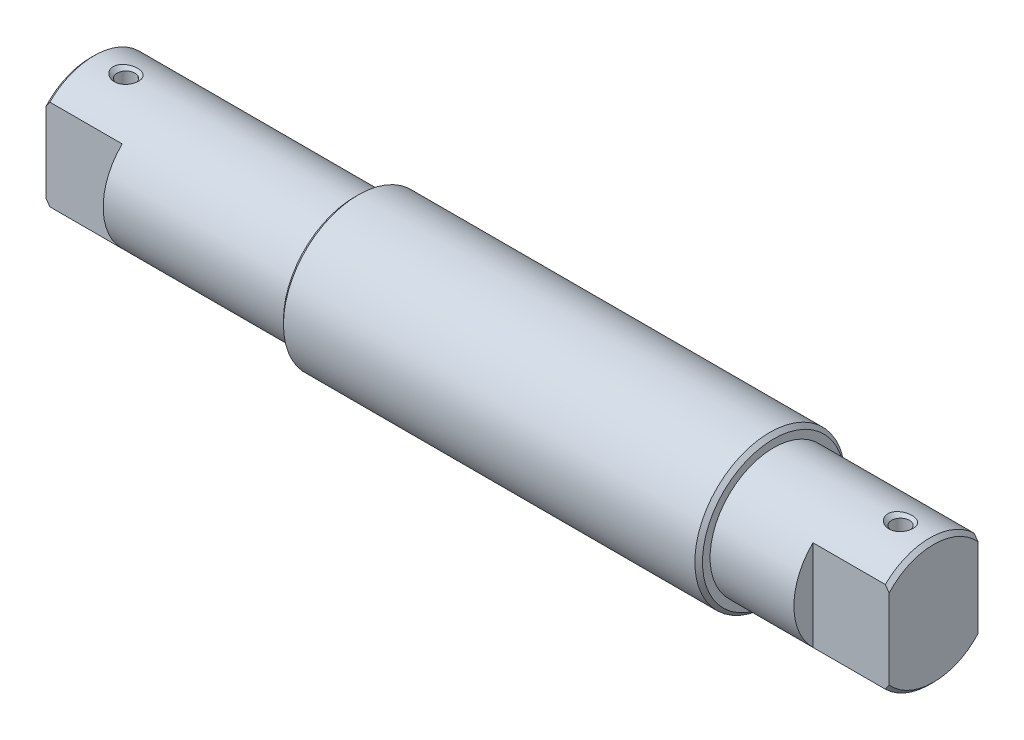
ISO-10303-21;
HEADER;
FILE_DESCRIPTION(('STEP AP214'),'2;1');
FILE_NAME('part.step','',(''),(''),'','','');
FILE_SCHEMA(('AUTOMOTIVE_DESIGN { 1 0 10303 214 1 1 1 1 }'));
ENDSEC;
DATA;
#1=APPLICATION_CONTEXT('core data for automotive mechanical design processes');
#2=APPLICATION_PROTOCOL_DEFINITION('international standard','automotive_design',2000,#1);
#3=PRODUCT_CONTEXT('',#1,'mechanical');
#4=PRODUCT('Part','Part','',(#3));
#5=PRODUCT_RELATED_PRODUCT_CATEGORY('part','',(#4));
#6=PRODUCT_DEFINITION_FORMATION('','',#4);
#7=PRODUCT_DEFINITION_CONTEXT('part definition',#1,'design');
#8=PRODUCT_DEFINITION('design','',#6,#7);
#9=PRODUCT_DEFINITION_SHAPE('','',#8);
#10=(LENGTH_UNIT() NAMED_UNIT(*) SI_UNIT(.MILLI.,.METRE.));
#11=(NAMED_UNIT(*) PLANE_ANGLE_UNIT() SI_UNIT($,.RADIAN.));
#12=(NAMED_UNIT(*) SI_UNIT($,.STERADIAN.) SOLID_ANGLE_UNIT());
#13=UNCERTAINTY_MEASURE_WITH_UNIT(LENGTH_MEASURE(1.E-05),#10,'distance_accuracy_value','');
#14=(GEOMETRIC_REPRESENTATION_CONTEXT(3) GLOBAL_UNCERTAINTY_ASSIGNED_CONTEXT((#13)) GLOBAL_UNIT_ASSIGNED_CONTEXT((#10,
#11,#12)) REPRESENTATION_CONTEXT('',''));
#15=CARTESIAN_POINT('',(0.,0.,0.));
#16=DIRECTION('',(0.,0.,1.));
#17=DIRECTION('',(1.,0.,0.));
#18=AXIS2_PLACEMENT_3D('',#15,#16,#17);
#19=CARTESIAN_POINT('',(-186.5,0.,0.));
#20=DIRECTION('',(-1.,0.,0.));
#21=DIRECTION('',(0.,0.,1.));
#22=AXIS2_PLACEMENT_3D('',#19,#20,#21);
#23=PLANE('',#22);
#24=DIRECTION('',(0.,1.,0.));
#25=VECTOR('',#24,1.);
#26=CARTESIAN_POINT('',(-186.5,-29.5,-17.5));
#27=LINE('',#26,#25);
#28=CARTESIAN_POINT('',(-186.5,-15.6843871413581,-17.5));
#29=VERTEX_POINT('',#28);
#30=CARTESIAN_POINT('',(-186.5,15.6843871413581,-17.5));
#31=VERTEX_POINT('',#30);
#32=EDGE_CURVE('E179',#29,#31,#27,.T.);
#33=ORIENTED_EDGE('',*,*,#32,.F.);
#34=CARTESIAN_POINT('',(-186.5,0.,0.));
#35=DIRECTION('',(-1.,0.,0.));
#36=DIRECTION('',(0.,0.,1.));
#37=AXIS2_PLACEMENT_3D('',#34,#35,#36);
#38=CIRCLE('',#37,23.5);
#39=CARTESIAN_POINT('',(-186.5,-15.684387141358,17.5));
#40=VERTEX_POINT('',#39);
#41=EDGE_CURVE('E79',#29,#40,#38,.T.);
#42=ORIENTED_EDGE('',*,*,#41,.T.);
#43=DIRECTION('',(0.,1.,0.));
#44=VECTOR('',#43,1.);
#45=CARTESIAN_POINT('',(-186.5,-29.5,17.5));
#46=LINE('',#45,#44);
#47=CARTESIAN_POINT('',(-186.5,15.684387141358,17.5));
#48=VERTEX_POINT('',#47);
#49=EDGE_CURVE('E180',#40,#48,#46,.T.);
#50=ORIENTED_EDGE('',*,*,#49,.T.);
#51=CARTESIAN_POINT('',(-186.5,0.,0.));
#52=DIRECTION('',(-1.,0.,0.));
#53=DIRECTION('',(0.,0.,1.));
#54=AXIS2_PLACEMENT_3D('',#51,#52,#53);
#55=CIRCLE('',#54,23.5);
#56=EDGE_CURVE('E291',#48,#31,#55,.T.);
#57=ORIENTED_EDGE('',*,*,#56,.T.);
#58=EDGE_LOOP('',(#33,#42,#50,#57));
#59=FACE_BOUND('',#58,.T.);
#60=ADVANCED_FACE('F51',(#59),#23,.T.);
#61=CARTESIAN_POINT('',(0.,0.,0.));
#62=DIRECTION('',(1.,0.,0.));
#63=DIRECTION('',(0.,0.,-1.));
#64=AXIS2_PLACEMENT_3D('',#61,#62,#63);
#65=CYLINDRICAL_SURFACE('',#64,25.);
#66=CARTESIAN_POINT('',(-175.87451643055,24.7713806982492,-3.37323429113115));
#67=CARTESIAN_POINT('',(-176.054904285761,24.7919838942568,-3.22192531773298));
#68=CARTESIAN_POINT('',(-176.224323752612,24.8129509446778,-3.05760155756745));
#69=CARTESIAN_POINT('',(-176.536831560512,24.8538278810952,-2.70530405270416));
#70=CARTESIAN_POINT('',(-176.679913323455,24.873737502107,-2.51732441939932));
#71=CARTESIAN_POINT('',(-176.951749786334,24.913049227429,-2.09532107667886));
#72=CARTESIAN_POINT('',(-177.0762502492,24.9320517889464,-1.85848709224746));
#73=CARTESIAN_POINT('',(-177.279774213361,24.9638943737445,-1.36557195571223));
#74=CARTESIAN_POINT('',(-177.358810347714,24.9767361087538,-1.10949617266055));
#75=CARTESIAN_POINT('',(-177.462403260972,24.9937177858799,-0.609292620347918));
#76=CARTESIAN_POINT('',(-177.491064485924,24.9985117038621,-0.366034222895478));
#77=CARTESIAN_POINT('',(-177.505353687032,25.0008914261414,0.121725595117452));
#78=CARTESIAN_POINT('',(-177.49099876398,24.9984800948399,0.366226483153137));
#79=CARTESIAN_POINT('',(-177.421806911306,24.9870473027214,0.836762863258603));
#80=CARTESIAN_POINT('',(-177.369016078707,24.9783601063455,1.0631123294828));
#81=CARTESIAN_POINT('',(-177.227615336017,24.9556952030214,1.50401064806853));
#82=CARTESIAN_POINT('',(-177.139002021696,24.9417169932736,1.71855837670289));
#83=CARTESIAN_POINT('',(-176.926404397799,24.9094269366926,2.13676099643176));
#84=CARTESIAN_POINT('',(-176.801476783937,24.8910020944918,2.33992566317875));
#85=CARTESIAN_POINT('',(-176.521820058459,24.8518732738762,2.72429689747722));
#86=CARTESIAN_POINT('',(-176.367081623108,24.8311685832786,2.90549656621767));
#87=CARTESIAN_POINT('',(-176.018679917744,24.7876539990077,3.25669847127003));
#88=CARTESIAN_POINT('',(-175.822863776946,24.7648108399028,3.42455960696461));
#89=CARTESIAN_POINT('',(-175.407563933135,24.7209334228327,3.72814021961705));
#90=CARTESIAN_POINT('',(-175.18807132763,24.6998998506639,3.86384754481425));
#91=CARTESIAN_POINT('',(-174.711332298834,24.6599689778281,4.11133071923222));
#92=CARTESIAN_POINT('',(-174.452462416676,24.6414115451149,4.22003997008984));
#93=CARTESIAN_POINT('',(-173.920483099517,24.610740183144,4.39538515998435));
#94=CARTESIAN_POINT('',(-173.647369878503,24.598627976773,4.4620098502004));
#95=CARTESIAN_POINT('',(-173.079272671536,24.5816829797426,4.5544765557269));
#96=CARTESIAN_POINT('',(-172.783894247899,24.5772670033888,4.57798680232435));
#97=CARTESIAN_POINT('',(-172.193221678811,24.5774969619837,4.57674856195032));
#98=CARTESIAN_POINT('',(-171.89792755126,24.5821441825752,4.55199322835505));
#99=CARTESIAN_POINT('',(-171.311050944015,24.6001084538053,4.453895178462));
#100=CARTESIAN_POINT('',(-171.01959653066,24.6135584993348,4.37980682509371));
#101=CARTESIAN_POINT('',(-170.453683766819,24.6476594511237,4.18362741985374));
#102=CARTESIAN_POINT('',(-170.179226733623,24.6683109146701,4.06153265287733));
#103=CARTESIAN_POINT('',(-169.659715421171,24.7139669662596,3.77368512697991));
#104=CARTESIAN_POINT('',(-169.414297486417,24.7389052375331,3.60858015729547));
#105=CARTESIAN_POINT('',(-168.956960860754,24.7902347427112,3.23716983041996));
#106=CARTESIAN_POINT('',(-168.745033448734,24.8166255959341,3.03087523100561));
#107=CARTESIAN_POINT('',(-168.374337185011,24.8658963621714,2.59470796450974));
#108=CARTESIAN_POINT('',(-168.213233549099,24.8888905375867,2.36683864403678));
#109=CARTESIAN_POINT('',(-167.936072569446,24.9300194228329,1.88477409002578));
#110=CARTESIAN_POINT('',(-167.819979598676,24.9481579724739,1.6305998801815));
#111=CARTESIAN_POINT('',(-167.6476255302,24.9756326291653,1.12906395871962));
#112=CARTESIAN_POINT('',(-167.586752870783,24.985637760996,0.88332199151219));
#113=CARTESIAN_POINT('',(-167.510185816022,24.9982797903987,0.384742040279786));
#114=CARTESIAN_POINT('',(-167.494467629477,25.0009205681147,0.131907863968604));
#115=CARTESIAN_POINT('',(-167.508471356841,24.9985895833484,-0.353949734998144));
#116=CARTESIAN_POINT('',(-167.534970079481,24.9941577594389,-0.587076007917359));
#117=CARTESIAN_POINT('',(-167.626214310213,24.9791828336602,-1.04547719897314));
#118=CARTESIAN_POINT('',(-167.690958696451,24.9686399110471,-1.27075234720049));
#119=CARTESIAN_POINT('',(-167.856055066784,24.9425532195152,-1.70797234123006));
#120=CARTESIAN_POINT('',(-167.956477463453,24.9269995673375,-1.91988984413887));
#121=CARTESIAN_POINT('',(-168.189064461542,24.8924691388041,-2.32517056601242));
#122=CARTESIAN_POINT('',(-168.321236972196,24.8734915097991,-2.51852914496095));
#123=CARTESIAN_POINT('',(-168.623097037215,24.8325151654542,-2.89562510243248));
#124=CARTESIAN_POINT('',(-168.79474313245,24.8103983627742,-3.07777940062069));
#125=CARTESIAN_POINT('',(-169.16401991363,24.7664423902139,-3.41351176583161));
#126=CARTESIAN_POINT('',(-169.361660472146,24.7446033292921,-3.56707892180315));
#127=CARTESIAN_POINT('',(-169.796474594868,24.7013391698462,-3.8557871063524));
#128=CARTESIAN_POINT('',(-170.035606206375,24.6801292986714,-3.98801450346232));
#129=CARTESIAN_POINT('',(-170.531896777101,24.6426180982318,-4.21360663233742));
#130=CARTESIAN_POINT('',(-170.789061177372,24.6263182584003,-4.30695957501006));
#131=CARTESIAN_POINT('',(-171.332418581652,24.5994032351841,-4.45822028116882));
#132=CARTESIAN_POINT('',(-171.619405651218,24.5892367726583,-4.51336658705345));
#133=CARTESIAN_POINT('',(-172.198717774701,24.5774979800561,-4.57685859204573));
#134=CARTESIAN_POINT('',(-172.491044130442,24.5759277747602,-4.58519272036333));
#135=CARTESIAN_POINT('',(-173.08108301877,24.5816378720877,-4.55448675353957));
#136=CARTESIAN_POINT('',(-173.378726981342,24.5891590467308,-4.51415739164136));
#137=CARTESIAN_POINT('',(-173.962852124293,24.6125788536205,-4.38466206332888));
#138=CARTESIAN_POINT('',(-174.249335585991,24.6284757640306,-4.29550613425554));
#139=CARTESIAN_POINT('',(-174.770045369015,24.664479246335,-4.08332405430202));
#140=CARTESIAN_POINT('',(-175.006456643428,24.6838717070159,-3.96550855848925));
#141=CARTESIAN_POINT('',(-175.45796671688,24.7258199151442,-3.69493358740631));
#142=CARTESIAN_POINT('',(-175.673080266862,24.7483734466876,-3.54219854372653));
#143=CARTESIAN_POINT('',(-175.87451643055,24.7713806982492,-3.37323429113115));
#144=B_SPLINE_CURVE_WITH_KNOTS('',3,(#66,#67,#68,#69,#70,#71,#72,#73,#74,#75,#76,#77,#78,#79,
#80,#81,#82,#83,#84,#85,#86,#87,#88,#89,#90,#91,#92,#93,#94,#95,#96,#97,#98,#99,#100,#101,#102,
#103,#104,#105,#106,#107,#108,#109,#110,#111,#112,#113,#114,#115,#116,#117,#118,#119,#120,#121,
#122,#123,#124,#125,#126,#127,#128,#129,#130,#131,#132,#133,#134,#135,#136,#137,#138,#139,#140,
#141,#142,#143),.UNSPECIFIED.,.T.,.F.,(4,2,2,2,2,2,2,2,2,2,2,2,2,2,2,2,2,2,2,2,2,2,2,2,2,2,2,2,
2,2,2,2,2,2,2,2,2,2,4),(0.,0.708343444701182,1.4168635659439,2.21712829351783,3.01717054600839,
3.74833532669744,4.47920947611892,5.17378214250879,5.86842083001643,6.58302195087691,
7.29784693674254,8.07136658328529,8.84517809837317,9.68561595267233,10.5262783534255,
11.4111994441007,12.2962460727388,13.194982794583,14.0937890812657,14.9797707906065,
15.865521404034,16.7009885829753,17.5357931128076,18.2918365841583,19.0474816346558,
19.7481427657545,20.4487833454711,21.1508144311677,21.8530205807099,22.6036525921341,
23.3545705176418,24.1732564977093,24.992190572535,25.8654386686655,26.7389026002137,
27.6360247045289,28.5329624554743,29.3245101031533,30.1155056272576),.UNSPECIFIED.);
#145=CARTESIAN_POINT('',(-175.87451643055,24.7713806982492,-3.37323429113115));
#146=VERTEX_POINT('',#145);
#147=EDGE_CURVE('E11',#146,#146,#144,.T.);
#148=ORIENTED_EDGE('',*,*,#147,.F.);
#149=EDGE_LOOP('',(#148));
#150=FACE_BOUND('',#149,.T.);
#151=DIRECTION('',(1.,0.,0.));
#152=VECTOR('',#151,1.);
#153=CARTESIAN_POINT('',(0.,-17.8535710713573,17.4999999999997));
#154=LINE('',#153,#152);
#155=CARTESIAN_POINT('',(-185.,-17.8535710713573,17.4999999999997));
#156=VERTEX_POINT('',#155);
#157=CARTESIAN_POINT('',(-156.5,-17.8535710713571,17.5));
#158=VERTEX_POINT('',#157);
#159=EDGE_CURVE('E224',#156,#158,#154,.T.);
#160=ORIENTED_EDGE('',*,*,#159,.F.);
#161=CARTESIAN_POINT('',(-185.,0.,0.));
#162=DIRECTION('',(-1.,0.,0.));
#163=DIRECTION('',(0.,0.,1.));
#164=AXIS2_PLACEMENT_3D('',#161,#162,#163);
#165=CIRCLE('',#164,25.);
#166=CARTESIAN_POINT('',(-185.,-17.8535710713574,-17.4999999999997));
#167=VERTEX_POINT('',#166);
#168=EDGE_CURVE('E454',#156,#167,#165,.F.);
#169=ORIENTED_EDGE('',*,*,#168,.T.);
#170=DIRECTION('',(1.,0.,0.));
#171=VECTOR('',#170,1.);
#172=CARTESIAN_POINT('',(0.,-17.8535710713574,-17.4999999999997));
#173=LINE('',#172,#171);
#174=CARTESIAN_POINT('',(-156.5,-17.8535710713574,-17.4999999999999));
#175=VERTEX_POINT('',#174);
#176=EDGE_CURVE('E219',#175,#167,#173,.F.);
#177=ORIENTED_EDGE('',*,*,#176,.F.);
#178=CARTESIAN_POINT('',(-156.5,0.,0.));
#179=DIRECTION('',(1.,0.,0.));
#180=DIRECTION('',(0.,0.,-1.));
#181=AXIS2_PLACEMENT_3D('',#178,#179,#180);
#182=CIRCLE('',#181,25.);
#183=CARTESIAN_POINT('',(-156.5,17.8535710713573,-17.4999999999999));
#184=VERTEX_POINT('',#183);
#185=EDGE_CURVE('E217',#184,#175,#182,.F.);
#186=ORIENTED_EDGE('',*,*,#185,.F.);
#187=DIRECTION('',(1.,0.,0.));
#188=VECTOR('',#187,1.);
#189=CARTESIAN_POINT('',(0.,17.8535710713574,-17.4999999999997));
#190=LINE('',#189,#188);
#191=CARTESIAN_POINT('',(-185.,17.8535710713574,-17.4999999999997));
#192=VERTEX_POINT('',#191);
#193=EDGE_CURVE('E215',#192,#184,#190,.T.);
#194=ORIENTED_EDGE('',*,*,#193,.F.);
#195=CARTESIAN_POINT('',(-185.,0.,0.));
#196=DIRECTION('',(-1.,0.,0.));
#197=DIRECTION('',(0.,0.,1.));
#198=AXIS2_PLACEMENT_3D('',#195,#196,#197);
#199=CIRCLE('',#198,25.);
#200=CARTESIAN_POINT('',(-185.,17.8535710713573,17.4999999999997));
#201=VERTEX_POINT('',#200);
#202=EDGE_CURVE('E352',#192,#201,#199,.F.);
#203=ORIENTED_EDGE('',*,*,#202,.T.);
#204=DIRECTION('',(1.,0.,0.));
#205=VECTOR('',#204,1.);
#206=CARTESIAN_POINT('',(0.,17.8535710713573,17.4999999999997));
#207=LINE('',#206,#205);
#208=CARTESIAN_POINT('',(-156.5,17.8535710713571,17.5));
#209=VERTEX_POINT('',#208);
#210=EDGE_CURVE('E226',#209,#201,#207,.F.);
#211=ORIENTED_EDGE('',*,*,#210,.F.);
#212=CARTESIAN_POINT('',(-156.5,0.,0.));
#213=DIRECTION('',(1.,0.,0.));
#214=DIRECTION('',(0.,0.,-1.));
#215=AXIS2_PLACEMENT_3D('',#212,#213,#214);
#216=CIRCLE('',#215,25.);
#217=EDGE_CURVE('E222',#158,#209,#216,.F.);
#218=ORIENTED_EDGE('',*,*,#217,.F.);
#219=EDGE_LOOP('',(#160,#169,#177,#186,#194,#203,#211,#218));
#220=FACE_BOUND('',#219,.T.);
#221=CARTESIAN_POINT('',(-82.5,0.,0.));
#222=DIRECTION('',(1.,0.,0.));
#223=DIRECTION('',(0.,0.,-1.));
#224=AXIS2_PLACEMENT_3D('',#221,#222,#223);
#225=CIRCLE('',#224,25.);
#226=CARTESIAN_POINT('',(-82.5,0.,-25.));
#227=VERTEX_POINT('',#226);
#228=EDGE_CURVE('E202',#227,#227,#225,.T.);
#229=ORIENTED_EDGE('',*,*,#228,.F.);
#230=EDGE_LOOP('',(#229));
#231=FACE_BOUND('',#230,.T.);
#232=ADVANCED_FACE('F362',(#150,#220,#231),#65,.T.);
#233=CARTESIAN_POINT('',(-82.5,25.,0.));
#234=DIRECTION('',(-1.,0.,0.));
#235=DIRECTION('',(0.,0.,1.));
#236=AXIS2_PLACEMENT_3D('',#233,#234,#235);
#237=PLANE('',#236);
#238=CARTESIAN_POINT('',(-82.5,0.,0.));
#239=DIRECTION('',(-1.,0.,0.));
#240=DIRECTION('',(0.,0.,1.));
#241=AXIS2_PLACEMENT_3D('',#238,#239,#240);
#242=CIRCLE('',#241,28.);
#243=CARTESIAN_POINT('',(-82.5,0.,28.));
#244=VERTEX_POINT('',#243);
#245=EDGE_CURVE('E388',#244,#244,#242,.T.);
#246=ORIENTED_EDGE('',*,*,#245,.T.);
#247=EDGE_LOOP('',(#246));
#248=FACE_BOUND('',#247,.T.);
#249=ORIENTED_EDGE('',*,*,#228,.T.);
#250=EDGE_LOOP('',(#249));
#251=FACE_BOUND('',#250,.T.);
#252=ADVANCED_FACE('F366',(#248,#251),#237,.T.);
#253=CARTESIAN_POINT('',(0.,0.,0.));
#254=DIRECTION('',(1.,0.,0.));
#255=DIRECTION('',(0.,0.,-1.));
#256=AXIS2_PLACEMENT_3D('',#253,#254,#255);
#257=CYLINDRICAL_SURFACE('',#256,29.5);
#258=CARTESIAN_POINT('',(80.9999999999999,0.,0.));
#259=DIRECTION('',(1.,0.,0.));
#260=DIRECTION('',(0.,0.,-1.));
#261=AXIS2_PLACEMENT_3D('',#258,#259,#260);
#262=CIRCLE('',#261,29.5);
#263=CARTESIAN_POINT('',(80.9999999999999,0.,-29.5));
#264=VERTEX_POINT('',#263);
#265=EDGE_CURVE('E424',#264,#264,#262,.F.);
#266=ORIENTED_EDGE('',*,*,#265,.T.);
#267=EDGE_LOOP('',(#266));
#268=FACE_BOUND('',#267,.T.);
#269=CARTESIAN_POINT('',(-81.,0.,0.));
#270=DIRECTION('',(-1.,0.,0.));
#271=DIRECTION('',(0.,0.,1.));
#272=AXIS2_PLACEMENT_3D('',#269,#270,#271);
#273=CIRCLE('',#272,29.5);
#274=CARTESIAN_POINT('',(-81.,0.,29.5));
#275=VERTEX_POINT('',#274);
#276=EDGE_CURVE('E422',#275,#275,#273,.F.);
#277=ORIENTED_EDGE('',*,*,#276,.T.);
#278=EDGE_LOOP('',(#277));
#279=FACE_BOUND('',#278,.T.);
#280=ADVANCED_FACE('F370',(#268,#279),#257,.T.);
#281=CARTESIAN_POINT('',(82.5,29.5,0.));
#282=DIRECTION('',(1.,0.,0.));
#283=DIRECTION('',(0.,0.,-1.));
#284=AXIS2_PLACEMENT_3D('',#281,#282,#283);
#285=PLANE('',#284);
#286=CARTESIAN_POINT('',(82.5,0.,0.));
#287=DIRECTION('',(1.,0.,0.));
#288=DIRECTION('',(0.,0.,-1.));
#289=AXIS2_PLACEMENT_3D('',#286,#287,#288);
#290=CIRCLE('',#289,27.9999999999999);
#291=CARTESIAN_POINT('',(82.5,0.,-27.9999999999999));
#292=VERTEX_POINT('',#291);
#293=EDGE_CURVE('E312',#292,#292,#290,.T.);
#294=ORIENTED_EDGE('',*,*,#293,.T.);
#295=EDGE_LOOP('',(#294));
#296=FACE_BOUND('',#295,.T.);
#297=CARTESIAN_POINT('',(82.5,0.,0.));
#298=DIRECTION('',(1.,0.,0.));
#299=DIRECTION('',(0.,0.,-1.));
#300=AXIS2_PLACEMENT_3D('',#297,#298,#299);
#301=CIRCLE('',#300,25.);
#302=CARTESIAN_POINT('',(82.5,0.,-25.));
#303=VERTEX_POINT('',#302);
#304=EDGE_CURVE('E199',#303,#303,#301,.T.);
#305=ORIENTED_EDGE('',*,*,#304,.F.);
#306=EDGE_LOOP('',(#305));
#307=FACE_BOUND('',#306,.T.);
#308=ADVANCED_FACE('F374',(#296,#307),#285,.T.);
#309=CARTESIAN_POINT('',(0.,0.,0.));
#310=DIRECTION('',(1.,0.,0.));
#311=DIRECTION('',(0.,0.,-1.));
#312=AXIS2_PLACEMENT_3D('',#309,#310,#311);
#313=CYLINDRICAL_SURFACE('',#312,25.);
#314=CARTESIAN_POINT('',(129.12548356945,24.7713806982492,-3.37323429113113));
#315=CARTESIAN_POINT('',(128.945095714239,24.7919838942568,-3.22192531773295));
#316=CARTESIAN_POINT('',(128.775676247388,24.8129509446778,-3.05760155756743));
#317=CARTESIAN_POINT('',(128.463168439488,24.8538278810952,-2.70530405270413));
#318=CARTESIAN_POINT('',(128.320086676545,24.873737502107,-2.51732441939929));
#319=CARTESIAN_POINT('',(128.048250213666,24.913049227429,-2.09532107667883));
#320=CARTESIAN_POINT('',(127.9237497508,24.9320517889464,-1.85848709224743));
#321=CARTESIAN_POINT('',(127.720225786639,24.9638943737445,-1.3655719557122));
#322=CARTESIAN_POINT('',(127.641189652286,24.9767361087538,-1.10949617266053));
#323=CARTESIAN_POINT('',(127.537596739028,24.9937177858799,-0.60929262034789));
#324=CARTESIAN_POINT('',(127.508935514076,24.9985117038621,-0.366034222895451));
#325=CARTESIAN_POINT('',(127.494646312968,25.0008914261414,0.121725595117477));
#326=CARTESIAN_POINT('',(127.50900123602,24.9984800948399,0.366226483153161));
#327=CARTESIAN_POINT('',(127.578193088694,24.9870473027214,0.836762863258626));
#328=CARTESIAN_POINT('',(127.630983921293,24.9783601063455,1.06311232948282));
#329=CARTESIAN_POINT('',(127.772384663983,24.9556952030214,1.50401064806855));
#330=CARTESIAN_POINT('',(127.860997978304,24.9417169932736,1.71855837670292));
#331=CARTESIAN_POINT('',(128.073595602201,24.9094269366926,2.13676099643178));
#332=CARTESIAN_POINT('',(128.198523216063,24.8910020944918,2.33992566317878));
#333=CARTESIAN_POINT('',(128.478179941541,24.8518732738762,2.72429689747724));
#334=CARTESIAN_POINT('',(128.632918376892,24.8311685832786,2.90549656621769));
#335=CARTESIAN_POINT('',(128.981320082256,24.7876539990077,3.25669847127005));
#336=CARTESIAN_POINT('',(129.177136223054,24.7648108399028,3.42455960696463));
#337=CARTESIAN_POINT('',(129.592436066865,24.7209334228327,3.72814021961707));
#338=CARTESIAN_POINT('',(129.81192867237,24.6998998506638,3.86384754481427));
#339=CARTESIAN_POINT('',(130.288667701166,24.6599689778281,4.11133071923224));
#340=CARTESIAN_POINT('',(130.547537583324,24.6414115451148,4.22003997008986));
#341=CARTESIAN_POINT('',(131.079516900483,24.610740183144,4.39538515998437));
#342=CARTESIAN_POINT('',(131.352630121497,24.598627976773,4.46200985020042));
#343=CARTESIAN_POINT('',(131.920727328464,24.5816829797425,4.55447655572692));
#344=CARTESIAN_POINT('',(132.216105752101,24.5772670033888,4.57798680232437));
#345=CARTESIAN_POINT('',(132.806778321189,24.5774969619837,4.57674856195035));
#346=CARTESIAN_POINT('',(133.10207244874,24.5821441825752,4.55199322835507));
#347=CARTESIAN_POINT('',(133.688949055985,24.6001084538053,4.45389517846202));
#348=CARTESIAN_POINT('',(133.98040346934,24.6135584993347,4.37980682509373));
#349=CARTESIAN_POINT('',(134.546316233181,24.6476594511237,4.18362741985376));
#350=CARTESIAN_POINT('',(134.820773266377,24.6683109146701,4.06153265287735));
#351=CARTESIAN_POINT('',(135.340284578829,24.7139669662595,3.77368512697993));
#352=CARTESIAN_POINT('',(135.585702513583,24.7389052375331,3.6085801572955));
#353=CARTESIAN_POINT('',(136.043039139246,24.7902347427112,3.23716983041999));
#354=CARTESIAN_POINT('',(136.254966551266,24.8166255959341,3.03087523100563));
#355=CARTESIAN_POINT('',(136.625662814989,24.8658963621714,2.59470796450975));
#356=CARTESIAN_POINT('',(136.786766450901,24.8888905375867,2.36683864403678));
#357=CARTESIAN_POINT('',(137.063927430554,24.9300194228329,1.88477409002578));
#358=CARTESIAN_POINT('',(137.180020401324,24.9481579724739,1.63059988018151));
#359=CARTESIAN_POINT('',(137.3523744698,24.9756326291653,1.12906395871964));
#360=CARTESIAN_POINT('',(137.413247129217,24.985637760996,0.883321991512208));
#361=CARTESIAN_POINT('',(137.489814183978,24.9982797903987,0.384742040279802));
#362=CARTESIAN_POINT('',(137.505532370523,25.0009205681147,0.13190786396862));
#363=CARTESIAN_POINT('',(137.491528643159,24.9985895833484,-0.353949734998125));
#364=CARTESIAN_POINT('',(137.465029920519,24.9941577594389,-0.587076007917336));
#365=CARTESIAN_POINT('',(137.373785689787,24.9791828336602,-1.04547719897312));
#366=CARTESIAN_POINT('',(137.309041303549,24.9686399110471,-1.27075234720047));
#367=CARTESIAN_POINT('',(137.143944933216,24.9425532195152,-1.70797234123004));
#368=CARTESIAN_POINT('',(137.043522536547,24.9269995673376,-1.91988984413884));
#369=CARTESIAN_POINT('',(136.810935538458,24.8924691388041,-2.32517056601239));
#370=CARTESIAN_POINT('',(136.678763027804,24.8734915097991,-2.51852914496092));
#371=CARTESIAN_POINT('',(136.376902962785,24.8325151654542,-2.89562510243245));
#372=CARTESIAN_POINT('',(136.20525686755,24.8103983627742,-3.07777940062066));
#373=CARTESIAN_POINT('',(135.83598008637,24.7664423902139,-3.41351176583158));
#374=CARTESIAN_POINT('',(135.638339527854,24.7446033292921,-3.56707892180313));
#375=CARTESIAN_POINT('',(135.203525405132,24.7013391698462,-3.85578710635237));
#376=CARTESIAN_POINT('',(134.964393793625,24.6801292986714,-3.98801450346229));
#377=CARTESIAN_POINT('',(134.468103222899,24.6426180982318,-4.21360663233738));
#378=CARTESIAN_POINT('',(134.210938822628,24.6263182584003,-4.30695957501002));
#379=CARTESIAN_POINT('',(133.667581418348,24.5994032351841,-4.45822028116879));
#380=CARTESIAN_POINT('',(133.380594348782,24.5892367726583,-4.51336658705342));
#381=CARTESIAN_POINT('',(132.801282225299,24.5774979800561,-4.57685859204571));
#382=CARTESIAN_POINT('',(132.508955869557,24.5759277747602,-4.58519272036331));
#383=CARTESIAN_POINT('',(131.91891698123,24.5816378720877,-4.55448675353954));
#384=CARTESIAN_POINT('',(131.621273018658,24.5891590467308,-4.51415739164133));
#385=CARTESIAN_POINT('',(131.037147875707,24.6125788536205,-4.38466206332884));
#386=CARTESIAN_POINT('',(130.750664414009,24.6284757640306,-4.29550613425551));
#387=CARTESIAN_POINT('',(130.229954630985,24.664479246335,-4.08332405430199));
#388=CARTESIAN_POINT('',(129.993543356572,24.6838717070159,-3.96550855848922));
#389=CARTESIAN_POINT('',(129.54203328312,24.7258199151442,-3.69493358740629));
#390=CARTESIAN_POINT('',(129.326919733138,24.7483734466876,-3.5421985437265));
#391=CARTESIAN_POINT('',(129.12548356945,24.7713806982492,-3.37323429113113));
#392=B_SPLINE_CURVE_WITH_KNOTS('',3,(#314,#315,#316,#317,#318,#319,#320,#321,#322,#323,#324,
#325,#326,#327,#328,#329,#330,#331,#332,#333,#334,#335,#336,#337,#338,#339,#340,#341,#342,#343,
#344,#345,#346,#347,#348,#349,#350,#351,#352,#353,#354,#355,#356,#357,#358,#359,#360,#361,#362,
#363,#364,#365,#366,#367,#368,#369,#370,#371,#372,#373,#374,#375,#376,#377,#378,#379,#380,#381,
#382,#383,#384,#385,#386,#387,#388,#389,#390,#391),.UNSPECIFIED.,.T.,.F.,(4,2,2,2,2,2,2,2,2,2,2,
2,2,2,2,2,2,2,2,2,2,2,2,2,2,2,2,2,2,2,2,2,2,2,2,2,2,2,4),(0.,0.708343444701182,1.4168635659439,
2.21712829351783,3.01717054600839,3.74833532669744,4.47920947611891,5.17378214250879,
5.86842083001642,6.5830219508769,7.29784693674253,8.07136658328529,8.84517809837316,
9.68561595267232,10.5262783534254,11.4111994441006,12.2962460727388,13.194982794583,
14.0937890812657,14.9797707906065,15.865521404034,16.7009885829753,17.5357931128076,
18.2918365841583,19.0474816346558,19.7481427657545,20.4487833454711,21.1508144311676,
21.8530205807099,22.6036525921341,23.3545705176418,24.1732564977092,24.992190572535,
25.8654386686655,26.7389026002138,27.636024704529,28.5329624554743,29.3245101031533,
30.1155056272575),.UNSPECIFIED.);
#393=CARTESIAN_POINT('',(129.12548356945,24.7713806982492,-3.37323429113113));
#394=VERTEX_POINT('',#393);
#395=EDGE_CURVE('E65',#394,#394,#392,.T.);
#396=ORIENTED_EDGE('',*,*,#395,.F.);
#397=EDGE_LOOP('',(#396));
#398=FACE_BOUND('',#397,.T.);
#399=DIRECTION('',(1.,0.,0.));
#400=VECTOR('',#399,1.);
#401=CARTESIAN_POINT('',(0.,-17.8535710713571,-17.5));
#402=LINE('',#401,#400);
#403=CARTESIAN_POINT('',(144.,-17.8535710713571,-17.5));
#404=VERTEX_POINT('',#403);
#405=CARTESIAN_POINT('',(115.5,-17.8535710713571,-17.5));
#406=VERTEX_POINT('',#405);
#407=EDGE_CURVE('E197',#404,#406,#402,.F.);
#408=ORIENTED_EDGE('',*,*,#407,.F.);
#409=CARTESIAN_POINT('',(144.,0.,0.));
#410=DIRECTION('',(1.,0.,0.));
#411=DIRECTION('',(0.,0.,-1.));
#412=AXIS2_PLACEMENT_3D('',#409,#410,#411);
#413=CIRCLE('',#412,25.);
#414=CARTESIAN_POINT('',(144.,-17.8535710713571,17.5));
#415=VERTEX_POINT('',#414);
#416=EDGE_CURVE('E657',#404,#415,#413,.F.);
#417=ORIENTED_EDGE('',*,*,#416,.T.);
#418=DIRECTION('',(1.,0.,0.));
#419=VECTOR('',#418,1.);
#420=CARTESIAN_POINT('',(0.,-17.8535710713571,17.5));
#421=LINE('',#420,#419);
#422=CARTESIAN_POINT('',(115.5,-17.8535710713571,17.5));
#423=VERTEX_POINT('',#422);
#424=EDGE_CURVE('E187',#423,#415,#421,.T.);
#425=ORIENTED_EDGE('',*,*,#424,.F.);
#426=CARTESIAN_POINT('',(115.5,0.,0.));
#427=DIRECTION('',(-1.,0.,0.));
#428=DIRECTION('',(0.,0.,1.));
#429=AXIS2_PLACEMENT_3D('',#426,#427,#428);
#430=CIRCLE('',#429,25.);
#431=CARTESIAN_POINT('',(115.5,17.8535710713571,17.5));
#432=VERTEX_POINT('',#431);
#433=EDGE_CURVE('E211',#432,#423,#430,.F.);
#434=ORIENTED_EDGE('',*,*,#433,.F.);
#435=DIRECTION('',(1.,0.,0.));
#436=VECTOR('',#435,1.);
#437=CARTESIAN_POINT('',(0.,17.8535710713571,17.5));
#438=LINE('',#437,#436);
#439=CARTESIAN_POINT('',(144.,17.8535710713571,17.5));
#440=VERTEX_POINT('',#439);
#441=EDGE_CURVE('E192',#440,#432,#438,.F.);
#442=ORIENTED_EDGE('',*,*,#441,.F.);
#443=CARTESIAN_POINT('',(144.,0.,0.));
#444=DIRECTION('',(1.,0.,0.));
#445=DIRECTION('',(0.,0.,-1.));
#446=AXIS2_PLACEMENT_3D('',#443,#444,#445);
#447=CIRCLE('',#446,25.);
#448=CARTESIAN_POINT('',(144.,17.8535710713571,-17.5));
#449=VERTEX_POINT('',#448);
#450=EDGE_CURVE('E655',#440,#449,#447,.F.);
#451=ORIENTED_EDGE('',*,*,#450,.T.);
#452=DIRECTION('',(1.,0.,0.));
#453=VECTOR('',#452,1.);
#454=CARTESIAN_POINT('',(0.,17.8535710713571,-17.5));
#455=LINE('',#454,#453);
#456=CARTESIAN_POINT('',(115.5,17.8535710713571,-17.5));
#457=VERTEX_POINT('',#456);
#458=EDGE_CURVE('E194',#457,#449,#455,.T.);
#459=ORIENTED_EDGE('',*,*,#458,.F.);
#460=CARTESIAN_POINT('',(115.5,0.,0.));
#461=DIRECTION('',(-1.,0.,0.));
#462=DIRECTION('',(0.,0.,1.));
#463=AXIS2_PLACEMENT_3D('',#460,#461,#462);
#464=CIRCLE('',#463,25.);
#465=EDGE_CURVE('E213',#406,#457,#464,.F.);
#466=ORIENTED_EDGE('',*,*,#465,.F.);
#467=EDGE_LOOP('',(#408,#417,#425,#434,#442,#451,#459,#466));
#468=FACE_BOUND('',#467,.T.);
#469=ORIENTED_EDGE('',*,*,#304,.T.);
#470=EDGE_LOOP('',(#469));
#471=FACE_BOUND('',#470,.T.);
#472=ADVANCED_FACE('F377',(#398,#468,#471),#313,.T.);
#473=CARTESIAN_POINT('',(145.5,25.,0.));
#474=DIRECTION('',(1.,0.,0.));
#475=DIRECTION('',(0.,0.,-1.));
#476=AXIS2_PLACEMENT_3D('',#473,#474,#475);
#477=PLANE('',#476);
#478=DIRECTION('',(0.,1.,0.));
#479=VECTOR('',#478,1.);
#480=CARTESIAN_POINT('',(145.5,25.,17.4999999999999));
#481=LINE('',#480,#479);
#482=CARTESIAN_POINT('',(145.5,-15.6843871413581,17.4999999999999));
#483=VERTEX_POINT('',#482);
#484=CARTESIAN_POINT('',(145.5,15.6843871413581,17.4999999999999));
#485=VERTEX_POINT('',#484);
#486=EDGE_CURVE('E205',#483,#485,#481,.T.);
#487=ORIENTED_EDGE('',*,*,#486,.F.);
#488=CARTESIAN_POINT('',(145.5,0.,0.));
#489=DIRECTION('',(1.,0.,0.));
#490=DIRECTION('',(0.,0.,-1.));
#491=AXIS2_PLACEMENT_3D('',#488,#489,#490);
#492=CIRCLE('',#491,23.5);
#493=CARTESIAN_POINT('',(145.5,-15.6843871413581,-17.5));
#494=VERTEX_POINT('',#493);
#495=EDGE_CURVE('E231',#483,#494,#492,.T.);
#496=ORIENTED_EDGE('',*,*,#495,.T.);
#497=DIRECTION('',(0.,-1.,0.));
#498=VECTOR('',#497,1.);
#499=CARTESIAN_POINT('',(145.5,25.,-17.5));
#500=LINE('',#499,#498);
#501=CARTESIAN_POINT('',(145.5,15.6843871413581,-17.5));
#502=VERTEX_POINT('',#501);
#503=EDGE_CURVE('E208',#502,#494,#500,.T.);
#504=ORIENTED_EDGE('',*,*,#503,.F.);
#505=CARTESIAN_POINT('',(145.5,0.,0.));
#506=DIRECTION('',(1.,0.,0.));
#507=DIRECTION('',(0.,0.,-1.));
#508=AXIS2_PLACEMENT_3D('',#505,#506,#507);
#509=CIRCLE('',#508,23.5);
#510=EDGE_CURVE('E228',#502,#485,#509,.T.);
#511=ORIENTED_EDGE('',*,*,#510,.T.);
#512=EDGE_LOOP('',(#487,#496,#504,#511));
#513=FACE_BOUND('',#512,.T.);
#514=ADVANCED_FACE('F273',(#513),#477,.T.);
#515=CARTESIAN_POINT('',(115.5,-29.5,17.5));
#516=DIRECTION('',(-1.,0.,0.));
#517=DIRECTION('',(0.,0.,1.));
#518=AXIS2_PLACEMENT_3D('',#515,#516,#517);
#519=PLANE('',#518);
#520=ORIENTED_EDGE('',*,*,#433,.T.);
#521=DIRECTION('',(0.,1.,0.));
#522=VECTOR('',#521,1.);
#523=CARTESIAN_POINT('',(115.5,-29.5,17.5));
#524=LINE('',#523,#522);
#525=EDGE_CURVE('E172',#423,#432,#524,.T.);
#526=ORIENTED_EDGE('',*,*,#525,.T.);
#527=EDGE_LOOP('',(#520,#526));
#528=FACE_BOUND('',#527,.T.);
#529=ADVANCED_FACE('F327',(#528),#519,.F.);
#530=CARTESIAN_POINT('',(145.5,-29.5,17.4999999999999));
#531=DIRECTION('',(0.,0.,-1.));
#532=DIRECTION('',(-1.,0.,0.));
#533=AXIS2_PLACEMENT_3D('',#530,#531,#532);
#534=PLANE('',#533);
#535=ORIENTED_EDGE('',*,*,#424,.T.);
#536=CARTESIAN_POINT('',(144.,-17.8535710713571,17.5));
#537=CARTESIAN_POINT('',(144.127732389972,-17.6747077904478,17.5));
#538=CARTESIAN_POINT('',(144.254844365963,-17.4954005141165,17.4999999999999));
#539=CARTESIAN_POINT('',(144.507728438254,-17.135860463141,17.4999999999999));
#540=CARTESIAN_POINT('',(144.633500617615,-16.9556277469085,17.4999999999999));
#541=CARTESIAN_POINT('',(144.883622725547,-16.5941759622362,17.4999999999999));
#542=CARTESIAN_POINT('',(145.007972645846,-16.4129568880686,17.4999999999999));
#543=CARTESIAN_POINT('',(145.255153531293,-16.0494694290749,17.4999999999999));
#544=CARTESIAN_POINT('',(145.377984401217,-15.867200979507,17.4999999999999));
#545=CARTESIAN_POINT('',(145.5,-15.6843871413581,17.4999999999999));
#546=B_SPLINE_CURVE_WITH_KNOTS('',3,(#536,#537,#538,#539,#540,#541,#542,#543,#544,#545),
.UNSPECIFIED.,.F.,.F.,(4,2,2,2,4),(0.,0.659369720519591,1.31869832249366,1.97803075733845,
2.637404315534),.UNSPECIFIED.);
#547=EDGE_CURVE('E346',#415,#483,#546,.T.);
#548=ORIENTED_EDGE('',*,*,#547,.T.);
#549=ORIENTED_EDGE('',*,*,#486,.T.);
#550=CARTESIAN_POINT('',(145.5,15.6843871413581,17.4999999999999));
#551=CARTESIAN_POINT('',(145.377984401217,15.867200979507,17.4999999999999));
#552=CARTESIAN_POINT('',(145.255153531293,16.0494694290749,17.4999999999999));
#553=CARTESIAN_POINT('',(145.007972645846,16.4129568880686,17.4999999999999));
#554=CARTESIAN_POINT('',(144.883622725547,16.5941759622362,17.4999999999999));
#555=CARTESIAN_POINT('',(144.633500617615,16.9556277469085,17.4999999999999));
#556=CARTESIAN_POINT('',(144.507728438254,17.135860463141,17.4999999999999));
#557=CARTESIAN_POINT('',(144.254844365963,17.4954005141165,17.4999999999999));
#558=CARTESIAN_POINT('',(144.127732389972,17.6747077904478,17.4999999999999));
#559=CARTESIAN_POINT('',(144.,17.8535710713572,17.4999999999999));
#560=B_SPLINE_CURVE_WITH_KNOTS('',3,(#550,#551,#552,#553,#554,#555,#556,#557,#558,#559),
.UNSPECIFIED.,.F.,.F.,(4,2,2,2,4),(0.,0.659373558195553,1.31870599304034,1.97803459501442,
2.637404315534),.UNSPECIFIED.);
#561=EDGE_CURVE('E339',#485,#440,#560,.T.);
#562=ORIENTED_EDGE('',*,*,#561,.T.);
#563=ORIENTED_EDGE('',*,*,#441,.T.);
#564=ORIENTED_EDGE('',*,*,#525,.F.);
#565=EDGE_LOOP('',(#535,#548,#549,#562,#563,#564));
#566=FACE_BOUND('',#565,.T.);
#567=ADVANCED_FACE('F259',(#566),#534,.F.);
#568=CARTESIAN_POINT('',(145.5,-29.5,-17.5));
#569=DIRECTION('',(0.,0.,1.));
#570=DIRECTION('',(1.,0.,0.));
#571=AXIS2_PLACEMENT_3D('',#568,#569,#570);
#572=PLANE('',#571);
#573=ORIENTED_EDGE('',*,*,#503,.T.);
#574=CARTESIAN_POINT('',(145.5,-15.6843871413581,-17.5));
#575=CARTESIAN_POINT('',(145.377984401217,-15.8672009795069,-17.5));
#576=CARTESIAN_POINT('',(145.255153531293,-16.0494694290748,-17.5));
#577=CARTESIAN_POINT('',(145.007972645846,-16.4129568880686,-17.5));
#578=CARTESIAN_POINT('',(144.883622725547,-16.5941759622362,-17.5));
#579=CARTESIAN_POINT('',(144.633500617615,-16.9556277469085,-17.5));
#580=CARTESIAN_POINT('',(144.507728438254,-17.135860463141,-17.5));
#581=CARTESIAN_POINT('',(144.254844365963,-17.4954005141165,-17.5));
#582=CARTESIAN_POINT('',(144.127732389972,-17.6747077904478,-17.5));
#583=CARTESIAN_POINT('',(144.,-17.8535710713572,-17.5));
#584=B_SPLINE_CURVE_WITH_KNOTS('',3,(#574,#575,#576,#577,#578,#579,#580,#581,#582,#583),
.UNSPECIFIED.,.F.,.F.,(4,2,2,2,4),(0.,0.659373558195564,1.31870599304038,1.97803459501447,
2.63740431553404),.UNSPECIFIED.);
#585=EDGE_CURVE('E242',#494,#404,#584,.T.);
#586=ORIENTED_EDGE('',*,*,#585,.T.);
#587=ORIENTED_EDGE('',*,*,#407,.T.);
#588=DIRECTION('',(0.,1.,0.));
#589=VECTOR('',#588,1.);
#590=CARTESIAN_POINT('',(115.5,-29.5,-17.5));
#591=LINE('',#590,#589);
#592=EDGE_CURVE('E175',#406,#457,#591,.T.);
#593=ORIENTED_EDGE('',*,*,#592,.T.);
#594=ORIENTED_EDGE('',*,*,#458,.T.);
#595=CARTESIAN_POINT('',(144.,17.8535710713571,-17.5));
#596=CARTESIAN_POINT('',(144.127732389972,17.6747077904478,-17.5));
#597=CARTESIAN_POINT('',(144.254844365963,17.4954005141165,-17.5));
#598=CARTESIAN_POINT('',(144.507728438254,17.135860463141,-17.5));
#599=CARTESIAN_POINT('',(144.633500617615,16.9556277469085,-17.5));
#600=CARTESIAN_POINT('',(144.883622725547,16.5941759622362,-17.5));
#601=CARTESIAN_POINT('',(145.007972645846,16.4129568880686,-17.5));
#602=CARTESIAN_POINT('',(145.255153531293,16.0494694290748,-17.5));
#603=CARTESIAN_POINT('',(145.377984401217,15.8672009795069,-17.5));
#604=CARTESIAN_POINT('',(145.5,15.6843871413581,-17.5));
#605=B_SPLINE_CURVE_WITH_KNOTS('',3,(#595,#596,#597,#598,#599,#600,#601,#602,#603,#604),
.UNSPECIFIED.,.F.,.F.,(4,2,2,2,4),(0.,0.659369720519566,1.31869832249366,1.97803075733848,
2.63740431553404),.UNSPECIFIED.);
#606=EDGE_CURVE('E234',#449,#502,#605,.T.);
#607=ORIENTED_EDGE('',*,*,#606,.T.);
#608=EDGE_LOOP('',(#573,#586,#587,#593,#594,#607));
#609=FACE_BOUND('',#608,.T.);
#610=ADVANCED_FACE('F253',(#609),#572,.F.);
#611=CARTESIAN_POINT('',(115.5,-29.5,-17.5));
#612=DIRECTION('',(-1.,0.,0.));
#613=DIRECTION('',(0.,0.,1.));
#614=AXIS2_PLACEMENT_3D('',#611,#612,#613);
#615=PLANE('',#614);
#616=ORIENTED_EDGE('',*,*,#592,.F.);
#617=ORIENTED_EDGE('',*,*,#465,.T.);
#618=EDGE_LOOP('',(#616,#617));
#619=FACE_BOUND('',#618,.T.);
#620=ADVANCED_FACE('F258',(#619),#615,.F.);
#621=CARTESIAN_POINT('',(-156.5,-29.5,-17.4999999999999));
#622=DIRECTION('',(1.,0.,0.));
#623=DIRECTION('',(0.,0.,-1.));
#624=AXIS2_PLACEMENT_3D('',#621,#622,#623);
#625=PLANE('',#624);
#626=ORIENTED_EDGE('',*,*,#185,.T.);
#627=DIRECTION('',(0.,1.,0.));
#628=VECTOR('',#627,1.);
#629=CARTESIAN_POINT('',(-156.5,-29.5,-17.4999999999999));
#630=LINE('',#629,#628);
#631=EDGE_CURVE('E184',#175,#184,#630,.T.);
#632=ORIENTED_EDGE('',*,*,#631,.T.);
#633=EDGE_LOOP('',(#626,#632));
#634=FACE_BOUND('',#633,.T.);
#635=ADVANCED_FACE('F262',(#634),#625,.F.);
#636=CARTESIAN_POINT('',(-186.5,-29.5,-17.5));
#637=DIRECTION('',(0.,0.,1.));
#638=DIRECTION('',(1.,0.,0.));
#639=AXIS2_PLACEMENT_3D('',#636,#637,#638);
#640=PLANE('',#639);
#641=ORIENTED_EDGE('',*,*,#176,.T.);
#642=CARTESIAN_POINT('',(-185.,-17.8535710713574,-17.4999999999997));
#643=CARTESIAN_POINT('',(-185.127732389972,-17.674707790448,-17.4999999999999));
#644=CARTESIAN_POINT('',(-185.254844365963,-17.4954005141167,-17.5));
#645=CARTESIAN_POINT('',(-185.507728438254,-17.1358604631411,-17.5));
#646=CARTESIAN_POINT('',(-185.633500617615,-16.9556277469086,-17.5));
#647=CARTESIAN_POINT('',(-185.883622725547,-16.5941759622363,-17.5));
#648=CARTESIAN_POINT('',(-186.007972645846,-16.4129568880686,-17.5));
#649=CARTESIAN_POINT('',(-186.255153531293,-16.0494694290748,-17.5));
#650=CARTESIAN_POINT('',(-186.377984401217,-15.8672009795069,-17.5));
#651=CARTESIAN_POINT('',(-186.5,-15.6843871413581,-17.5));
#652=B_SPLINE_CURVE_WITH_KNOTS('',3,(#642,#643,#644,#645,#646,#647,#648,#649,#650,#651),
.UNSPECIFIED.,.F.,.F.,(4,2,2,2,4),(0.,0.659369720519615,1.31869832249375,1.97803075733859,
2.63740431553421),.UNSPECIFIED.);
#653=EDGE_CURVE('E285',#167,#29,#652,.T.);
#654=ORIENTED_EDGE('',*,*,#653,.T.);
#655=ORIENTED_EDGE('',*,*,#32,.T.);
#656=CARTESIAN_POINT('',(-186.5,15.6843871413581,-17.5));
#657=CARTESIAN_POINT('',(-186.377984401217,15.8672009795069,-17.5));
#658=CARTESIAN_POINT('',(-186.255153531293,16.0494694290748,-17.5));
#659=CARTESIAN_POINT('',(-186.007972645846,16.4129568880686,-17.5));
#660=CARTESIAN_POINT('',(-185.883622725547,16.5941759622363,-17.5));
#661=CARTESIAN_POINT('',(-185.633500617615,16.9556277469086,-17.5));
#662=CARTESIAN_POINT('',(-185.507728438254,17.1358604631411,-17.5));
#663=CARTESIAN_POINT('',(-185.254844365963,17.4954005141166,-17.5));
#664=CARTESIAN_POINT('',(-185.127732389972,17.674707790448,-17.5));
#665=CARTESIAN_POINT('',(-185.,17.8535710713573,-17.5));
#666=B_SPLINE_CURVE_WITH_KNOTS('',3,(#656,#657,#658,#659,#660,#661,#662,#663,#664,#665),
.UNSPECIFIED.,.F.,.F.,(4,2,2,2,4),(0.,0.659373558195611,1.31870599304045,1.97803459501458,
2.63740431553421),.UNSPECIFIED.);
#667=EDGE_CURVE('E277',#31,#192,#666,.T.);
#668=ORIENTED_EDGE('',*,*,#667,.T.);
#669=ORIENTED_EDGE('',*,*,#193,.T.);
#670=ORIENTED_EDGE('',*,*,#631,.F.);
#671=EDGE_LOOP('',(#641,#654,#655,#668,#669,#670));
#672=FACE_BOUND('',#671,.T.);
#673=ADVANCED_FACE('F266',(#672),#640,.F.);
#674=CARTESIAN_POINT('',(-186.5,-29.5,17.5));
#675=DIRECTION('',(0.,0.,-1.));
#676=DIRECTION('',(-1.,0.,0.));
#677=AXIS2_PLACEMENT_3D('',#674,#675,#676);
#678=PLANE('',#677);
#679=ORIENTED_EDGE('',*,*,#49,.F.);
#680=CARTESIAN_POINT('',(-186.5,-15.684387141358,17.5));
#681=CARTESIAN_POINT('',(-186.377984401217,-15.8672009795069,17.5));
#682=CARTESIAN_POINT('',(-186.255153531293,-16.0494694290748,17.5));
#683=CARTESIAN_POINT('',(-186.007972645846,-16.4129568880686,17.5));
#684=CARTESIAN_POINT('',(-185.883622725547,-16.5941759622362,17.5));
#685=CARTESIAN_POINT('',(-185.633500617615,-16.9556277469086,17.5));
#686=CARTESIAN_POINT('',(-185.507728438254,-17.1358604631411,17.5));
#687=CARTESIAN_POINT('',(-185.254844365963,-17.4954005141166,17.5));
#688=CARTESIAN_POINT('',(-185.127732389972,-17.6747077904479,17.5));
#689=CARTESIAN_POINT('',(-185.,-17.8535710713573,17.5));
#690=B_SPLINE_CURVE_WITH_KNOTS('',3,(#680,#681,#682,#683,#684,#685,#686,#687,#688,#689),
.UNSPECIFIED.,.F.,.F.,(4,2,2,2,4),(0.,0.659373558195617,1.31870599304047,1.97803459501461,
2.63740431553424),.UNSPECIFIED.);
#691=EDGE_CURVE('E305',#40,#156,#690,.T.);
#692=ORIENTED_EDGE('',*,*,#691,.T.);
#693=ORIENTED_EDGE('',*,*,#159,.T.);
#694=DIRECTION('',(0.,1.,0.));
#695=VECTOR('',#694,1.);
#696=CARTESIAN_POINT('',(-156.5,-29.5,17.5));
#697=LINE('',#696,#695);
#698=EDGE_CURVE('E176',#158,#209,#697,.T.);
#699=ORIENTED_EDGE('',*,*,#698,.T.);
#700=ORIENTED_EDGE('',*,*,#210,.T.);
#701=CARTESIAN_POINT('',(-185.,17.8535710713573,17.4999999999997));
#702=CARTESIAN_POINT('',(-185.127732389972,17.674707790448,17.4999999999999));
#703=CARTESIAN_POINT('',(-185.254844365963,17.4954005141166,17.5));
#704=CARTESIAN_POINT('',(-185.507728438254,17.1358604631411,17.5000000000001));
#705=CARTESIAN_POINT('',(-185.633500617615,16.9556277469086,17.5));
#706=CARTESIAN_POINT('',(-185.883622725547,16.5941759622362,17.5));
#707=CARTESIAN_POINT('',(-186.007972645846,16.4129568880686,17.5));
#708=CARTESIAN_POINT('',(-186.255153531293,16.0494694290748,17.5));
#709=CARTESIAN_POINT('',(-186.377984401217,15.8672009795069,17.5));
#710=CARTESIAN_POINT('',(-186.5,15.684387141358,17.5));
#711=B_SPLINE_CURVE_WITH_KNOTS('',3,(#701,#702,#703,#704,#705,#706,#707,#708,#709,#710),
.UNSPECIFIED.,.F.,.F.,(4,2,2,2,4),(0.,0.659369720519634,1.31869832249377,1.97803075733863,
2.63740431553425),.UNSPECIFIED.);
#712=EDGE_CURVE('E72',#201,#48,#711,.T.);
#713=ORIENTED_EDGE('',*,*,#712,.T.);
#714=EDGE_LOOP('',(#679,#692,#693,#699,#700,#713));
#715=FACE_BOUND('',#714,.T.);
#716=ADVANCED_FACE('F271',(#715),#678,.F.);
#717=CARTESIAN_POINT('',(-156.5,-29.5,17.5));
#718=DIRECTION('',(1.,0.,0.));
#719=DIRECTION('',(0.,0.,-1.));
#720=AXIS2_PLACEMENT_3D('',#717,#718,#719);
#721=PLANE('',#720);
#722=ORIENTED_EDGE('',*,*,#698,.F.);
#723=ORIENTED_EDGE('',*,*,#217,.T.);
#724=EDGE_LOOP('',(#722,#723));
#725=FACE_BOUND('',#724,.T.);
#726=ADVANCED_FACE('F321',(#725),#721,.F.);
#727=CARTESIAN_POINT('',(145.5,0.,0.));
#728=DIRECTION('',(-1.,0.,0.));
#729=DIRECTION('',(0.,0.,1.));
#730=AXIS2_PLACEMENT_3D('',#727,#728,#729);
#731=CONICAL_SURFACE('',#730,23.5,0.785398163397434);
#732=ORIENTED_EDGE('',*,*,#547,.F.);
#733=ORIENTED_EDGE('',*,*,#416,.F.);
#734=ORIENTED_EDGE('',*,*,#585,.F.);
#735=ORIENTED_EDGE('',*,*,#495,.F.);
#736=EDGE_LOOP('',(#732,#733,#734,#735));
#737=FACE_BOUND('',#736,.T.);
#738=ADVANCED_FACE('F325',(#737),#731,.T.);
#739=CARTESIAN_POINT('',(145.5,0.,0.));
#740=DIRECTION('',(-1.,0.,0.));
#741=DIRECTION('',(0.,0.,1.));
#742=AXIS2_PLACEMENT_3D('',#739,#740,#741);
#743=CONICAL_SURFACE('',#742,23.5,0.785398163397434);
#744=ORIENTED_EDGE('',*,*,#606,.F.);
#745=ORIENTED_EDGE('',*,*,#450,.F.);
#746=ORIENTED_EDGE('',*,*,#561,.F.);
#747=ORIENTED_EDGE('',*,*,#510,.F.);
#748=EDGE_LOOP('',(#744,#745,#746,#747));
#749=FACE_BOUND('',#748,.T.);
#750=ADVANCED_FACE('F250',(#749),#743,.T.);
#751=CARTESIAN_POINT('',(-185.,0.,0.));
#752=DIRECTION('',(1.,0.,0.));
#753=DIRECTION('',(0.,0.,-1.));
#754=AXIS2_PLACEMENT_3D('',#751,#752,#753);
#755=CONICAL_SURFACE('',#754,25.,0.785398163397445);
#756=ORIENTED_EDGE('',*,*,#691,.F.);
#757=ORIENTED_EDGE('',*,*,#41,.F.);
#758=ORIENTED_EDGE('',*,*,#653,.F.);
#759=ORIENTED_EDGE('',*,*,#168,.F.);
#760=EDGE_LOOP('',(#756,#757,#758,#759));
#761=FACE_BOUND('',#760,.T.);
#762=ADVANCED_FACE('F294',(#761),#755,.T.);
#763=CARTESIAN_POINT('',(-185.,0.,0.));
#764=DIRECTION('',(1.,0.,0.));
#765=DIRECTION('',(0.,0.,-1.));
#766=AXIS2_PLACEMENT_3D('',#763,#764,#765);
#767=CONICAL_SURFACE('',#766,25.,0.785398163397445);
#768=ORIENTED_EDGE('',*,*,#667,.F.);
#769=ORIENTED_EDGE('',*,*,#56,.F.);
#770=ORIENTED_EDGE('',*,*,#712,.F.);
#771=ORIENTED_EDGE('',*,*,#202,.F.);
#772=EDGE_LOOP('',(#768,#769,#770,#771));
#773=FACE_BOUND('',#772,.T.);
#774=ADVANCED_FACE('F300',(#773),#767,.T.);
#775=CARTESIAN_POINT('',(82.5,0.,0.));
#776=DIRECTION('',(-1.,0.,0.));
#777=DIRECTION('',(0.,0.,1.));
#778=AXIS2_PLACEMENT_3D('',#775,#776,#777);
#779=CONICAL_SURFACE('',#778,27.9999999999999,0.785398163397448);
#780=ORIENTED_EDGE('',*,*,#265,.F.);
#781=EDGE_LOOP('',(#780));
#782=FACE_BOUND('',#781,.T.);
#783=ORIENTED_EDGE('',*,*,#293,.F.);
#784=EDGE_LOOP('',(#783));
#785=FACE_BOUND('',#784,.T.);
#786=ADVANCED_FACE('F411',(#782,#785),#779,.T.);
#787=CARTESIAN_POINT('',(-81.,0.,0.));
#788=DIRECTION('',(1.,0.,0.));
#789=DIRECTION('',(0.,0.,-1.));
#790=AXIS2_PLACEMENT_3D('',#787,#788,#789);
#791=CONICAL_SURFACE('',#790,29.5,0.785398163397449);
#792=ORIENTED_EDGE('',*,*,#245,.F.);
#793=EDGE_LOOP('',(#792));
#794=FACE_BOUND('',#793,.T.);
#795=ORIENTED_EDGE('',*,*,#276,.F.);
#796=EDGE_LOOP('',(#795));
#797=FACE_BOUND('',#796,.T.);
#798=ADVANCED_FACE('F54',(#794,#797),#791,.T.);
#799=CARTESIAN_POINT('',(132.5,4.99999999999998,0.));
#800=DIRECTION('',(0.,1.,0.));
#801=DIRECTION('',(0.,0.,1.));
#802=AXIS2_PLACEMENT_3D('',#799,#800,#801);
#803=CONICAL_SURFACE('',#802,3.5,1.02974425867665);
#804=CARTESIAN_POINT('',(132.5,2.89698783340352,0.));
#805=VERTEX_POINT('',#804);
#806=VERTEX_LOOP('',#805);
#807=FACE_BOUND('',#806,.T.);
#808=CARTESIAN_POINT('',(132.5,4.99999999999998,0.));
#809=DIRECTION('',(0.,1.,0.));
#810=DIRECTION('',(0.,0.,1.));
#811=AXIS2_PLACEMENT_3D('',#808,#809,#810);
#812=CIRCLE('',#811,3.5);
#813=CARTESIAN_POINT('',(132.5,4.99999999999998,3.50000000000001));
#814=VERTEX_POINT('',#813);
#815=EDGE_CURVE('E165',#814,#814,#812,.T.);
#816=ORIENTED_EDGE('',*,*,#815,.T.);
#817=EDGE_LOOP('',(#816));
#818=FACE_BOUND('',#817,.T.);
#819=ADVANCED_FACE('F335',(#807,#818),#803,.F.);
#820=CARTESIAN_POINT('',(132.5,25.,0.));
#821=DIRECTION('',(0.,1.,0.));
#822=DIRECTION('',(0.,0.,1.));
#823=AXIS2_PLACEMENT_3D('',#820,#821,#822);
#824=CYLINDRICAL_SURFACE('',#823,3.5);
#825=ORIENTED_EDGE('',*,*,#815,.F.);
#826=EDGE_LOOP('',(#825));
#827=FACE_BOUND('',#826,.T.);
#828=CARTESIAN_POINT('',(132.5,23.5,0.));
#829=DIRECTION('',(0.,1.,0.));
#830=DIRECTION('',(0.,0.,1.));
#831=AXIS2_PLACEMENT_3D('',#828,#829,#830);
#832=CIRCLE('',#831,3.5);
#833=CARTESIAN_POINT('',(132.5,23.5,3.50000000000001));
#834=VERTEX_POINT('',#833);
#835=EDGE_CURVE('E161',#834,#834,#832,.T.);
#836=ORIENTED_EDGE('',*,*,#835,.T.);
#837=EDGE_LOOP('',(#836));
#838=FACE_BOUND('',#837,.T.);
#839=ADVANCED_FACE('F392',(#827,#838),#824,.F.);
#840=CARTESIAN_POINT('',(132.5,25.,0.));
#841=DIRECTION('',(0.,1.,0.));
#842=DIRECTION('',(0.,0.,1.));
#843=AXIS2_PLACEMENT_3D('',#840,#841,#842);
#844=CONICAL_SURFACE('',#843,5.,0.785398163397448);
#845=ORIENTED_EDGE('',*,*,#395,.T.);
#846=EDGE_LOOP('',(#845));
#847=FACE_BOUND('',#846,.T.);
#848=ORIENTED_EDGE('',*,*,#835,.F.);
#849=EDGE_LOOP('',(#848));
#850=FACE_BOUND('',#849,.T.);
#851=ADVANCED_FACE('F155',(#847,#850),#844,.F.);
#852=CARTESIAN_POINT('',(-172.5,4.99999999999998,0.));
#853=DIRECTION('',(0.,1.,0.));
#854=DIRECTION('',(0.,0.,1.));
#855=AXIS2_PLACEMENT_3D('',#852,#853,#854);
#856=CONICAL_SURFACE('',#855,3.5,1.02974425867665);
#857=CARTESIAN_POINT('',(-172.5,2.89698783340352,0.));
#858=VERTEX_POINT('',#857);
#859=VERTEX_LOOP('',#858);
#860=FACE_BOUND('',#859,.T.);
#861=CARTESIAN_POINT('',(-172.5,4.99999999999998,0.));
#862=DIRECTION('',(0.,1.,0.));
#863=DIRECTION('',(0.,0.,1.));
#864=AXIS2_PLACEMENT_3D('',#861,#862,#863);
#865=CIRCLE('',#864,3.5);
#866=CARTESIAN_POINT('',(-172.5,4.99999999999998,3.5));
#867=VERTEX_POINT('',#866);
#868=EDGE_CURVE('E159',#867,#867,#865,.T.);
#869=ORIENTED_EDGE('',*,*,#868,.T.);
#870=EDGE_LOOP('',(#869));
#871=FACE_BOUND('',#870,.T.);
#872=ADVANCED_FACE('F151',(#860,#871),#856,.F.);
#873=CARTESIAN_POINT('',(-172.5,25.,0.));
#874=DIRECTION('',(0.,1.,0.));
#875=DIRECTION('',(0.,0.,1.));
#876=AXIS2_PLACEMENT_3D('',#873,#874,#875);
#877=CYLINDRICAL_SURFACE('',#876,3.5);
#878=ORIENTED_EDGE('',*,*,#868,.F.);
#879=EDGE_LOOP('',(#878));
#880=FACE_BOUND('',#879,.T.);
#881=CARTESIAN_POINT('',(-172.5,23.5,0.));
#882=DIRECTION('',(0.,1.,0.));
#883=DIRECTION('',(0.,0.,1.));
#884=AXIS2_PLACEMENT_3D('',#881,#882,#883);
#885=CIRCLE('',#884,3.5);
#886=CARTESIAN_POINT('',(-172.5,23.5,3.49999999999999));
#887=VERTEX_POINT('',#886);
#888=EDGE_CURVE('E162',#887,#887,#885,.T.);
#889=ORIENTED_EDGE('',*,*,#888,.T.);
#890=EDGE_LOOP('',(#889));
#891=FACE_BOUND('',#890,.T.);
#892=ADVANCED_FACE('F154',(#880,#891),#877,.F.);
#893=CARTESIAN_POINT('',(-172.5,25.,0.));
#894=DIRECTION('',(0.,1.,0.));
#895=DIRECTION('',(0.,0.,1.));
#896=AXIS2_PLACEMENT_3D('',#893,#894,#895);
#897=CONICAL_SURFACE('',#896,5.,0.785398163397448);
#898=ORIENTED_EDGE('',*,*,#147,.T.);
#899=EDGE_LOOP('',(#898));
#900=FACE_BOUND('',#899,.T.);
#901=ORIENTED_EDGE('',*,*,#888,.F.);
#902=EDGE_LOOP('',(#901));
#903=FACE_BOUND('',#902,.T.);
#904=ADVANCED_FACE('F602',(#900,#903),#897,.F.);
#905=CLOSED_SHELL('',(#60,#232,#252,#280,#308,#472,#514,#529,#567,#610,#620,#635,#673,#716,#726,
#738,#750,#762,#774,#786,#798,#819,#839,#851,#872,#892,#904));
#906=MANIFOLD_SOLID_BREP('B2',#905);
#907=ADVANCED_BREP_SHAPE_REPRESENTATION('',(#18,#906),#14);
#908=SHAPE_DEFINITION_REPRESENTATION(#9,#907);
ENDSEC;
END-ISO-10303-21;
